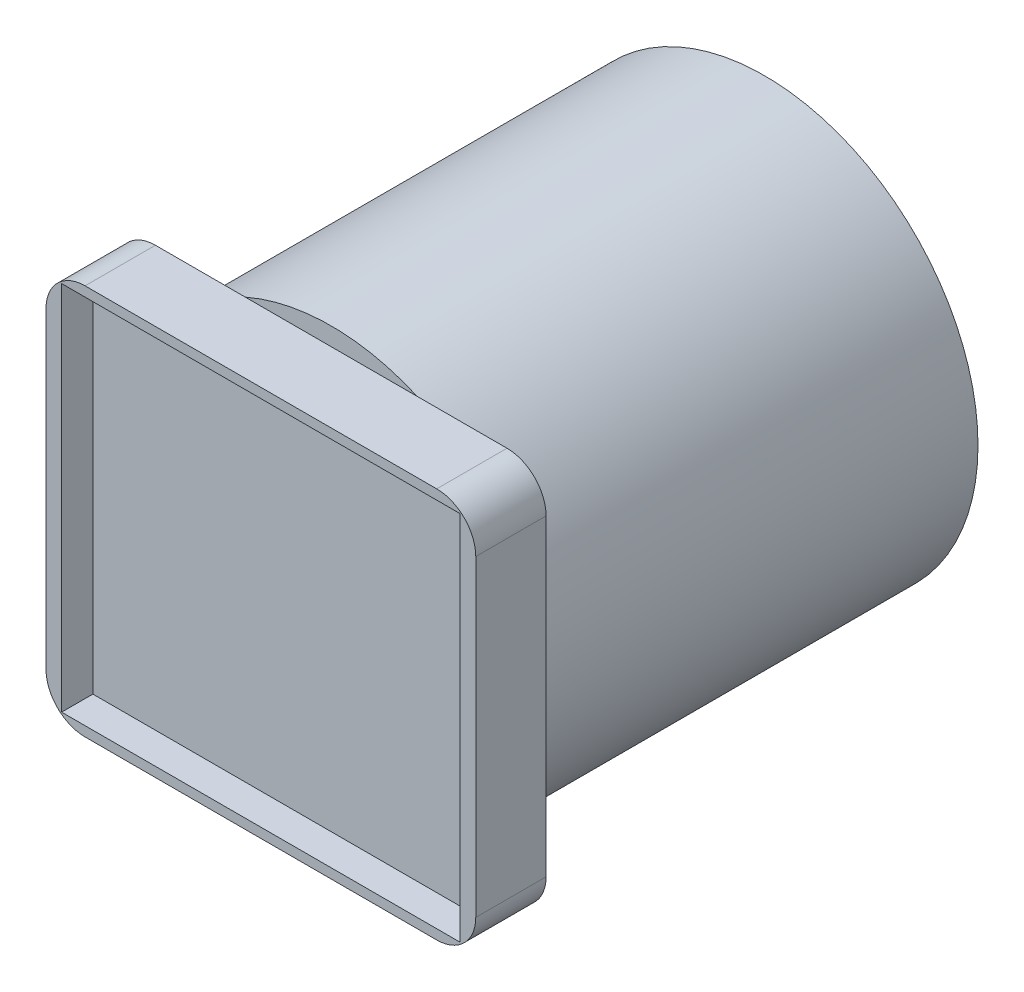
ISO-10303-21;
HEADER;
FILE_DESCRIPTION(('STEP AP214'),'2;1');
FILE_NAME('part.step','',(''),(''),'','','');
FILE_SCHEMA(('AUTOMOTIVE_DESIGN { 1 0 10303 214 1 1 1 1 }'));
ENDSEC;
DATA;
#1=APPLICATION_CONTEXT('core data for automotive mechanical design processes');
#2=APPLICATION_PROTOCOL_DEFINITION('international standard','automotive_design',2000,#1);
#3=PRODUCT_CONTEXT('',#1,'mechanical');
#4=PRODUCT('Part','Part','',(#3));
#5=PRODUCT_RELATED_PRODUCT_CATEGORY('part','',(#4));
#6=PRODUCT_DEFINITION_FORMATION('','',#4);
#7=PRODUCT_DEFINITION_CONTEXT('part definition',#1,'design');
#8=PRODUCT_DEFINITION('design','',#6,#7);
#9=PRODUCT_DEFINITION_SHAPE('','',#8);
#10=(LENGTH_UNIT() NAMED_UNIT(*) SI_UNIT(.MILLI.,.METRE.));
#11=(NAMED_UNIT(*) PLANE_ANGLE_UNIT() SI_UNIT($,.RADIAN.));
#12=(NAMED_UNIT(*) SI_UNIT($,.STERADIAN.) SOLID_ANGLE_UNIT());
#13=UNCERTAINTY_MEASURE_WITH_UNIT(LENGTH_MEASURE(1.E-05),#10,'distance_accuracy_value','');
#14=(GEOMETRIC_REPRESENTATION_CONTEXT(3) GLOBAL_UNCERTAINTY_ASSIGNED_CONTEXT((#13)) GLOBAL_UNIT_ASSIGNED_CONTEXT((#10,
#11,#12)) REPRESENTATION_CONTEXT('',''));
#15=CARTESIAN_POINT('',(0.,0.,0.));
#16=DIRECTION('',(0.,0.,1.));
#17=DIRECTION('',(1.,0.,0.));
#18=AXIS2_PLACEMENT_3D('',#15,#16,#17);
#19=CARTESIAN_POINT('',(0.,0.,-2.54));
#20=DIRECTION('',(0.,0.,-1.));
#21=DIRECTION('',(-1.,0.,0.));
#22=AXIS2_PLACEMENT_3D('',#19,#20,#21);
#23=PLANE('',#22);
#24=DIRECTION('',(0.,-1.,0.));
#25=VECTOR('',#24,1.);
#26=CARTESIAN_POINT('',(13.97,12.7,-2.54));
#27=LINE('',#26,#25);
#28=CARTESIAN_POINT('',(13.97,10.16,-2.54));
#29=VERTEX_POINT('',#28);
#30=CARTESIAN_POINT('',(13.97,-10.16,-2.54));
#31=VERTEX_POINT('',#30);
#32=EDGE_CURVE('E141',#29,#31,#27,.T.);
#33=ORIENTED_EDGE('',*,*,#32,.T.);
#34=CARTESIAN_POINT('',(11.43,-10.16,-2.54));
#35=DIRECTION('',(0.,0.,-1.));
#36=DIRECTION('',(-1.,0.,0.));
#37=AXIS2_PLACEMENT_3D('',#34,#35,#36);
#38=CIRCLE('',#37,2.54);
#39=CARTESIAN_POINT('',(11.43,-12.7,-2.54));
#40=VERTEX_POINT('',#39);
#41=EDGE_CURVE('E224',#31,#40,#38,.T.);
#42=ORIENTED_EDGE('',*,*,#41,.T.);
#43=DIRECTION('',(-1.,0.,0.));
#44=VECTOR('',#43,1.);
#45=CARTESIAN_POINT('',(13.97,-12.7,-2.54));
#46=LINE('',#45,#44);
#47=CARTESIAN_POINT('',(5.5873685722798,-12.7,-2.54));
#48=VERTEX_POINT('',#47);
#49=EDGE_CURVE('E169',#40,#48,#46,.T.);
#50=ORIENTED_EDGE('',*,*,#49,.T.);
#51=CARTESIAN_POINT('',(0.,0.,-2.54));
#52=DIRECTION('',(0.,0.,-1.));
#53=DIRECTION('',(-1.,0.,0.));
#54=AXIS2_PLACEMENT_3D('',#51,#52,#53);
#55=CIRCLE('',#54,13.87475);
#56=CARTESIAN_POINT('',(5.58736857227979,12.7,-2.54));
#57=VERTEX_POINT('',#56);
#58=EDGE_CURVE('E160',#57,#48,#55,.T.);
#59=ORIENTED_EDGE('',*,*,#58,.F.);
#60=DIRECTION('',(1.,0.,0.));
#61=VECTOR('',#60,1.);
#62=CARTESIAN_POINT('',(-13.97,12.7,-2.54));
#63=LINE('',#62,#61);
#64=CARTESIAN_POINT('',(11.43,12.7,-2.54));
#65=VERTEX_POINT('',#64);
#66=EDGE_CURVE('E144',#57,#65,#63,.T.);
#67=ORIENTED_EDGE('',*,*,#66,.T.);
#68=CARTESIAN_POINT('',(11.43,10.16,-2.54));
#69=DIRECTION('',(0.,0.,-1.));
#70=DIRECTION('',(-1.,0.,0.));
#71=AXIS2_PLACEMENT_3D('',#68,#69,#70);
#72=CIRCLE('',#71,2.54);
#73=EDGE_CURVE('E222',#65,#29,#72,.T.);
#74=ORIENTED_EDGE('',*,*,#73,.T.);
#75=EDGE_LOOP('',(#33,#42,#50,#59,#67,#74));
#76=FACE_BOUND('',#75,.T.);
#77=ADVANCED_FACE('F36',(#76),#23,.T.);
#78=CARTESIAN_POINT('',(0.,0.,2.032));
#79=DIRECTION('',(0.,0.,1.));
#80=DIRECTION('',(1.,0.,0.));
#81=AXIS2_PLACEMENT_3D('',#78,#79,#80);
#82=PLANE('',#81);
#83=DIRECTION('',(1.,0.,0.));
#84=VECTOR('',#83,1.);
#85=CARTESIAN_POINT('',(13.97,-12.7,2.032));
#86=LINE('',#85,#84);
#87=CARTESIAN_POINT('',(-11.43,-12.7,2.032));
#88=VERTEX_POINT('',#87);
#89=CARTESIAN_POINT('',(11.43,-12.7,2.032));
#90=VERTEX_POINT('',#89);
#91=EDGE_CURVE('E209',#88,#90,#86,.T.);
#92=ORIENTED_EDGE('',*,*,#91,.T.);
#93=CARTESIAN_POINT('',(11.43,-10.16,2.032));
#94=DIRECTION('',(0.,0.,1.));
#95=DIRECTION('',(1.,0.,0.));
#96=AXIS2_PLACEMENT_3D('',#93,#94,#95);
#97=CIRCLE('',#96,2.54);
#98=CARTESIAN_POINT('',(13.97,-10.16,2.032));
#99=VERTEX_POINT('',#98);
#100=EDGE_CURVE('E237',#90,#99,#97,.T.);
#101=ORIENTED_EDGE('',*,*,#100,.T.);
#102=DIRECTION('',(0.,1.,0.));
#103=VECTOR('',#102,1.);
#104=CARTESIAN_POINT('',(13.97,-12.7,2.032));
#105=LINE('',#104,#103);
#106=CARTESIAN_POINT('',(13.97,10.16,2.032));
#107=VERTEX_POINT('',#106);
#108=EDGE_CURVE('E212',#99,#107,#105,.T.);
#109=ORIENTED_EDGE('',*,*,#108,.T.);
#110=CARTESIAN_POINT('',(11.43,10.16,2.032));
#111=DIRECTION('',(0.,0.,1.));
#112=DIRECTION('',(1.,0.,0.));
#113=AXIS2_PLACEMENT_3D('',#110,#111,#112);
#114=CIRCLE('',#113,2.54);
#115=CARTESIAN_POINT('',(11.43,12.7,2.032));
#116=VERTEX_POINT('',#115);
#117=EDGE_CURVE('E231',#107,#116,#114,.T.);
#118=ORIENTED_EDGE('',*,*,#117,.T.);
#119=DIRECTION('',(-1.,0.,0.));
#120=VECTOR('',#119,1.);
#121=CARTESIAN_POINT('',(13.97,12.7,2.032));
#122=LINE('',#121,#120);
#123=CARTESIAN_POINT('',(-11.43,12.7,2.032));
#124=VERTEX_POINT('',#123);
#125=EDGE_CURVE('E161',#116,#124,#122,.T.);
#126=ORIENTED_EDGE('',*,*,#125,.T.);
#127=CARTESIAN_POINT('',(-11.43,10.16,2.032));
#128=DIRECTION('',(0.,0.,1.));
#129=DIRECTION('',(1.,0.,0.));
#130=AXIS2_PLACEMENT_3D('',#127,#128,#129);
#131=CIRCLE('',#130,2.54);
#132=CARTESIAN_POINT('',(-13.97,10.16,2.032));
#133=VERTEX_POINT('',#132);
#134=EDGE_CURVE('E233',#124,#133,#131,.T.);
#135=ORIENTED_EDGE('',*,*,#134,.T.);
#136=DIRECTION('',(0.,-1.,0.));
#137=VECTOR('',#136,1.);
#138=CARTESIAN_POINT('',(-13.97,-12.7,2.032));
#139=LINE('',#138,#137);
#140=CARTESIAN_POINT('',(-13.97,-10.16,2.032));
#141=VERTEX_POINT('',#140);
#142=EDGE_CURVE('E206',#133,#141,#139,.T.);
#143=ORIENTED_EDGE('',*,*,#142,.T.);
#144=CARTESIAN_POINT('',(-11.43,-10.16,2.032));
#145=DIRECTION('',(0.,0.,1.));
#146=DIRECTION('',(1.,0.,0.));
#147=AXIS2_PLACEMENT_3D('',#144,#145,#146);
#148=CIRCLE('',#147,2.54);
#149=EDGE_CURVE('E235',#141,#88,#148,.T.);
#150=ORIENTED_EDGE('',*,*,#149,.T.);
#151=EDGE_LOOP('',(#92,#101,#109,#118,#126,#135,#143,#150));
#152=FACE_BOUND('',#151,.T.);
#153=DIRECTION('',(1.,0.,0.));
#154=VECTOR('',#153,1.);
#155=CARTESIAN_POINT('',(12.954,-12.065,2.032));
#156=LINE('',#155,#154);
#157=CARTESIAN_POINT('',(-12.954,-12.065,2.032));
#158=VERTEX_POINT('',#157);
#159=CARTESIAN_POINT('',(12.954,-12.065,2.032));
#160=VERTEX_POINT('',#159);
#161=EDGE_CURVE('E179',#158,#160,#156,.T.);
#162=ORIENTED_EDGE('',*,*,#161,.F.);
#163=DIRECTION('',(0.,-1.,0.));
#164=VECTOR('',#163,1.);
#165=CARTESIAN_POINT('',(-12.954,-12.065,2.032));
#166=LINE('',#165,#164);
#167=CARTESIAN_POINT('',(-12.954,12.065,2.032));
#168=VERTEX_POINT('',#167);
#169=EDGE_CURVE('E177',#168,#158,#166,.T.);
#170=ORIENTED_EDGE('',*,*,#169,.F.);
#171=DIRECTION('',(-1.,0.,0.));
#172=VECTOR('',#171,1.);
#173=CARTESIAN_POINT('',(12.954,12.065,2.032));
#174=LINE('',#173,#172);
#175=CARTESIAN_POINT('',(12.954,12.065,2.032));
#176=VERTEX_POINT('',#175);
#177=EDGE_CURVE('E185',#176,#168,#174,.T.);
#178=ORIENTED_EDGE('',*,*,#177,.F.);
#179=DIRECTION('',(0.,1.,0.));
#180=VECTOR('',#179,1.);
#181=CARTESIAN_POINT('',(12.954,-12.065,2.032));
#182=LINE('',#181,#180);
#183=EDGE_CURVE('E182',#160,#176,#182,.T.);
#184=ORIENTED_EDGE('',*,*,#183,.F.);
#185=EDGE_LOOP('',(#162,#170,#178,#184));
#186=FACE_BOUND('',#185,.T.);
#187=ADVANCED_FACE('F270',(#152,#186),#82,.T.);
#188=CARTESIAN_POINT('',(-13.97,-12.7,2.032));
#189=DIRECTION('',(1.,0.,0.));
#190=DIRECTION('',(0.,0.,-1.));
#191=AXIS2_PLACEMENT_3D('',#188,#189,#190);
#192=PLANE('',#191);
#193=DIRECTION('',(0.,1.,0.));
#194=VECTOR('',#193,1.);
#195=CARTESIAN_POINT('',(-13.97,-12.7,-2.54));
#196=LINE('',#195,#194);
#197=CARTESIAN_POINT('',(-13.97,-10.16,-2.54));
#198=VERTEX_POINT('',#197);
#199=CARTESIAN_POINT('',(-13.97,10.16,-2.54));
#200=VERTEX_POINT('',#199);
#201=EDGE_CURVE('E171',#198,#200,#196,.T.);
#202=ORIENTED_EDGE('',*,*,#201,.F.);
#203=DIRECTION('',(0.,0.,-1.));
#204=VECTOR('',#203,1.);
#205=CARTESIAN_POINT('',(-13.97,-10.16,2.032));
#206=LINE('',#205,#204);
#207=EDGE_CURVE('E244',#198,#141,#206,.F.);
#208=ORIENTED_EDGE('',*,*,#207,.T.);
#209=ORIENTED_EDGE('',*,*,#142,.F.);
#210=DIRECTION('',(0.,0.,-1.));
#211=VECTOR('',#210,1.);
#212=CARTESIAN_POINT('',(-13.97,10.16,2.032));
#213=LINE('',#212,#211);
#214=EDGE_CURVE('E242',#133,#200,#213,.T.);
#215=ORIENTED_EDGE('',*,*,#214,.T.);
#216=EDGE_LOOP('',(#202,#208,#209,#215));
#217=FACE_BOUND('',#216,.T.);
#218=ADVANCED_FACE('F274',(#217),#192,.F.);
#219=CARTESIAN_POINT('',(13.97,-12.7,2.032));
#220=DIRECTION('',(0.,1.,0.));
#221=DIRECTION('',(-1.,0.,0.));
#222=AXIS2_PLACEMENT_3D('',#219,#220,#221);
#223=PLANE('',#222);
#224=ORIENTED_EDGE('',*,*,#49,.F.);
#225=DIRECTION('',(0.,0.,-1.));
#226=VECTOR('',#225,1.);
#227=CARTESIAN_POINT('',(11.43,-12.7,2.032));
#228=LINE('',#227,#226);
#229=EDGE_CURVE('E229',#40,#90,#228,.F.);
#230=ORIENTED_EDGE('',*,*,#229,.T.);
#231=ORIENTED_EDGE('',*,*,#91,.F.);
#232=DIRECTION('',(0.,0.,-1.));
#233=VECTOR('',#232,1.);
#234=CARTESIAN_POINT('',(-11.43,-12.7,2.032));
#235=LINE('',#234,#233);
#236=CARTESIAN_POINT('',(-11.43,-12.7,-2.54));
#237=VERTEX_POINT('',#236);
#238=EDGE_CURVE('E226',#88,#237,#235,.T.);
#239=ORIENTED_EDGE('',*,*,#238,.T.);
#240=CARTESIAN_POINT('',(-5.58736857227979,-12.7,-2.54));
#241=VERTEX_POINT('',#240);
#242=EDGE_CURVE('E166',#241,#237,#46,.T.);
#243=ORIENTED_EDGE('',*,*,#242,.F.);
#244=EDGE_CURVE('E172',#48,#241,#46,.T.);
#245=ORIENTED_EDGE('',*,*,#244,.F.);
#246=EDGE_LOOP('',(#224,#230,#231,#239,#243,#245));
#247=FACE_BOUND('',#246,.T.);
#248=ADVANCED_FACE('F256',(#247),#223,.F.);
#249=CARTESIAN_POINT('',(13.97,-12.7,2.032));
#250=DIRECTION('',(-1.,0.,0.));
#251=DIRECTION('',(0.,0.,1.));
#252=AXIS2_PLACEMENT_3D('',#249,#250,#251);
#253=PLANE('',#252);
#254=ORIENTED_EDGE('',*,*,#108,.F.);
#255=DIRECTION('',(0.,0.,-1.));
#256=VECTOR('',#255,1.);
#257=CARTESIAN_POINT('',(13.97,-10.16,2.032));
#258=LINE('',#257,#256);
#259=EDGE_CURVE('E219',#99,#31,#258,.T.);
#260=ORIENTED_EDGE('',*,*,#259,.T.);
#261=ORIENTED_EDGE('',*,*,#32,.F.);
#262=DIRECTION('',(0.,0.,-1.));
#263=VECTOR('',#262,1.);
#264=CARTESIAN_POINT('',(13.97,10.16,2.032));
#265=LINE('',#264,#263);
#266=EDGE_CURVE('E217',#29,#107,#265,.F.);
#267=ORIENTED_EDGE('',*,*,#266,.T.);
#268=EDGE_LOOP('',(#254,#260,#261,#267));
#269=FACE_BOUND('',#268,.T.);
#270=ADVANCED_FACE('F299',(#269),#253,.F.);
#271=CARTESIAN_POINT('',(13.97,12.7,2.032));
#272=DIRECTION('',(0.,-1.,0.));
#273=DIRECTION('',(1.,0.,0.));
#274=AXIS2_PLACEMENT_3D('',#271,#272,#273);
#275=PLANE('',#274);
#276=CARTESIAN_POINT('',(-11.43,12.7,-2.54));
#277=VERTEX_POINT('',#276);
#278=CARTESIAN_POINT('',(-5.5873685722798,12.7,-2.54));
#279=VERTEX_POINT('',#278);
#280=EDGE_CURVE('E133',#277,#279,#63,.T.);
#281=ORIENTED_EDGE('',*,*,#280,.F.);
#282=DIRECTION('',(0.,0.,-1.));
#283=VECTOR('',#282,1.);
#284=CARTESIAN_POINT('',(-11.43,12.7,2.032));
#285=LINE('',#284,#283);
#286=EDGE_CURVE('E11',#277,#124,#285,.F.);
#287=ORIENTED_EDGE('',*,*,#286,.T.);
#288=ORIENTED_EDGE('',*,*,#125,.F.);
#289=DIRECTION('',(0.,0.,-1.));
#290=VECTOR('',#289,1.);
#291=CARTESIAN_POINT('',(11.43,12.7,2.032));
#292=LINE('',#291,#290);
#293=EDGE_CURVE('E44',#116,#65,#292,.T.);
#294=ORIENTED_EDGE('',*,*,#293,.T.);
#295=ORIENTED_EDGE('',*,*,#66,.F.);
#296=EDGE_CURVE('E142',#279,#57,#63,.T.);
#297=ORIENTED_EDGE('',*,*,#296,.F.);
#298=EDGE_LOOP('',(#281,#287,#288,#294,#295,#297));
#299=FACE_BOUND('',#298,.T.);
#300=ADVANCED_FACE('F147',(#299),#275,.F.);
#301=CARTESIAN_POINT('',(-12.954,-12.065,2.032));
#302=DIRECTION('',(1.,0.,0.));
#303=DIRECTION('',(0.,0.,-1.));
#304=AXIS2_PLACEMENT_3D('',#301,#302,#303);
#305=PLANE('',#304);
#306=DIRECTION('',(0.,-1.,0.));
#307=VECTOR('',#306,1.);
#308=CARTESIAN_POINT('',(-12.954,-12.065,0.));
#309=LINE('',#308,#307);
#310=CARTESIAN_POINT('',(-12.954,12.065,0.));
#311=VERTEX_POINT('',#310);
#312=CARTESIAN_POINT('',(-12.954,-12.065,0.));
#313=VERTEX_POINT('',#312);
#314=EDGE_CURVE('E176',#311,#313,#309,.T.);
#315=ORIENTED_EDGE('',*,*,#314,.F.);
#316=DIRECTION('',(0.,0.,-1.));
#317=VECTOR('',#316,1.);
#318=CARTESIAN_POINT('',(-12.954,12.065,2.032));
#319=LINE('',#318,#317);
#320=EDGE_CURVE('E187',#168,#311,#319,.T.);
#321=ORIENTED_EDGE('',*,*,#320,.F.);
#322=ORIENTED_EDGE('',*,*,#169,.T.);
#323=DIRECTION('',(0.,0.,-1.));
#324=VECTOR('',#323,1.);
#325=CARTESIAN_POINT('',(-12.954,-12.065,2.032));
#326=LINE('',#325,#324);
#327=EDGE_CURVE('E203',#158,#313,#326,.T.);
#328=ORIENTED_EDGE('',*,*,#327,.T.);
#329=EDGE_LOOP('',(#315,#321,#322,#328));
#330=FACE_BOUND('',#329,.T.);
#331=ADVANCED_FACE('F292',(#330),#305,.T.);
#332=CARTESIAN_POINT('',(12.954,-12.065,2.032));
#333=DIRECTION('',(0.,1.,0.));
#334=DIRECTION('',(-1.,0.,0.));
#335=AXIS2_PLACEMENT_3D('',#332,#333,#334);
#336=PLANE('',#335);
#337=DIRECTION('',(1.,0.,0.));
#338=VECTOR('',#337,1.);
#339=CARTESIAN_POINT('',(12.954,-12.065,0.));
#340=LINE('',#339,#338);
#341=CARTESIAN_POINT('',(12.954,-12.065,0.));
#342=VERTEX_POINT('',#341);
#343=EDGE_CURVE('E190',#313,#342,#340,.T.);
#344=ORIENTED_EDGE('',*,*,#343,.F.);
#345=ORIENTED_EDGE('',*,*,#327,.F.);
#346=ORIENTED_EDGE('',*,*,#161,.T.);
#347=DIRECTION('',(0.,0.,-1.));
#348=VECTOR('',#347,1.);
#349=CARTESIAN_POINT('',(12.954,-12.065,2.032));
#350=LINE('',#349,#348);
#351=EDGE_CURVE('E201',#160,#342,#350,.T.);
#352=ORIENTED_EDGE('',*,*,#351,.T.);
#353=EDGE_LOOP('',(#344,#345,#346,#352));
#354=FACE_BOUND('',#353,.T.);
#355=ADVANCED_FACE('F288',(#354),#336,.T.);
#356=CARTESIAN_POINT('',(12.954,-12.065,2.032));
#357=DIRECTION('',(-1.,0.,0.));
#358=DIRECTION('',(0.,0.,1.));
#359=AXIS2_PLACEMENT_3D('',#356,#357,#358);
#360=PLANE('',#359);
#361=DIRECTION('',(0.,1.,0.));
#362=VECTOR('',#361,1.);
#363=CARTESIAN_POINT('',(12.954,-12.065,0.));
#364=LINE('',#363,#362);
#365=CARTESIAN_POINT('',(12.954,12.065,0.));
#366=VERTEX_POINT('',#365);
#367=EDGE_CURVE('E193',#342,#366,#364,.T.);
#368=ORIENTED_EDGE('',*,*,#367,.F.);
#369=ORIENTED_EDGE('',*,*,#351,.F.);
#370=ORIENTED_EDGE('',*,*,#183,.T.);
#371=DIRECTION('',(0.,0.,-1.));
#372=VECTOR('',#371,1.);
#373=CARTESIAN_POINT('',(12.954,12.065,2.032));
#374=LINE('',#373,#372);
#375=EDGE_CURVE('E199',#176,#366,#374,.T.);
#376=ORIENTED_EDGE('',*,*,#375,.T.);
#377=EDGE_LOOP('',(#368,#369,#370,#376));
#378=FACE_BOUND('',#377,.T.);
#379=ADVANCED_FACE('F284',(#378),#360,.T.);
#380=CARTESIAN_POINT('',(12.954,12.065,2.032));
#381=DIRECTION('',(0.,-1.,0.));
#382=DIRECTION('',(1.,0.,0.));
#383=AXIS2_PLACEMENT_3D('',#380,#381,#382);
#384=PLANE('',#383);
#385=DIRECTION('',(-1.,0.,0.));
#386=VECTOR('',#385,1.);
#387=CARTESIAN_POINT('',(12.954,12.065,0.));
#388=LINE('',#387,#386);
#389=EDGE_CURVE('E180',#366,#311,#388,.T.);
#390=ORIENTED_EDGE('',*,*,#389,.F.);
#391=ORIENTED_EDGE('',*,*,#375,.F.);
#392=ORIENTED_EDGE('',*,*,#177,.T.);
#393=ORIENTED_EDGE('',*,*,#320,.T.);
#394=EDGE_LOOP('',(#390,#391,#392,#393));
#395=FACE_BOUND('',#394,.T.);
#396=ADVANCED_FACE('F280',(#395),#384,.T.);
#397=CARTESIAN_POINT('',(0.,0.,0.));
#398=DIRECTION('',(0.,0.,-1.));
#399=DIRECTION('',(-1.,0.,0.));
#400=AXIS2_PLACEMENT_3D('',#397,#398,#399);
#401=PLANE('',#400);
#402=ORIENTED_EDGE('',*,*,#389,.T.);
#403=ORIENTED_EDGE('',*,*,#314,.T.);
#404=ORIENTED_EDGE('',*,*,#343,.T.);
#405=ORIENTED_EDGE('',*,*,#367,.T.);
#406=EDGE_LOOP('',(#402,#403,#404,#405));
#407=FACE_BOUND('',#406,.T.);
#408=ADVANCED_FACE('F265',(#407),#401,.F.);
#409=ORIENTED_EDGE('',*,*,#242,.T.);
#410=CARTESIAN_POINT('',(-11.43,-10.16,-2.54));
#411=DIRECTION('',(0.,0.,-1.));
#412=DIRECTION('',(-1.,0.,0.));
#413=AXIS2_PLACEMENT_3D('',#410,#411,#412);
#414=CIRCLE('',#413,2.54);
#415=EDGE_CURVE('E240',#237,#198,#414,.T.);
#416=ORIENTED_EDGE('',*,*,#415,.T.);
#417=ORIENTED_EDGE('',*,*,#201,.T.);
#418=CARTESIAN_POINT('',(-11.43,10.16,-2.54));
#419=DIRECTION('',(0.,0.,-1.));
#420=DIRECTION('',(-1.,0.,0.));
#421=AXIS2_PLACEMENT_3D('',#418,#419,#420);
#422=CIRCLE('',#421,2.54);
#423=EDGE_CURVE('E51',#200,#277,#422,.T.);
#424=ORIENTED_EDGE('',*,*,#423,.T.);
#425=ORIENTED_EDGE('',*,*,#280,.T.);
#426=EDGE_CURVE('E138',#241,#279,#55,.T.);
#427=ORIENTED_EDGE('',*,*,#426,.F.);
#428=EDGE_LOOP('',(#409,#416,#417,#424,#425,#427));
#429=FACE_BOUND('',#428,.T.);
#430=ADVANCED_FACE('F136',(#429),#23,.T.);
#431=CARTESIAN_POINT('',(0.,0.,-2.54));
#432=DIRECTION('',(0.,0.,-1.));
#433=DIRECTION('',(-1.,0.,0.));
#434=AXIS2_PLACEMENT_3D('',#431,#432,#433);
#435=PLANE('',#434);
#436=EDGE_CURVE('E159',#48,#241,#55,.T.);
#437=ORIENTED_EDGE('',*,*,#436,.F.);
#438=ORIENTED_EDGE('',*,*,#244,.T.);
#439=EDGE_LOOP('',(#437,#438));
#440=FACE_BOUND('',#439,.T.);
#441=ADVANCED_FACE('F258',(#440),#435,.F.);
#442=EDGE_CURVE('E157',#279,#57,#55,.T.);
#443=ORIENTED_EDGE('',*,*,#442,.F.);
#444=ORIENTED_EDGE('',*,*,#296,.T.);
#445=EDGE_LOOP('',(#443,#444));
#446=FACE_BOUND('',#445,.T.);
#447=ADVANCED_FACE('F163',(#446),#435,.F.);
#448=CARTESIAN_POINT('',(0.,0.,-30.715));
#449=DIRECTION('',(0.,0.,1.));
#450=DIRECTION('',(1.,0.,0.));
#451=AXIS2_PLACEMENT_3D('',#448,#449,#450);
#452=CYLINDRICAL_SURFACE('',#451,13.87475);
#453=CARTESIAN_POINT('',(0.,0.,-30.715));
#454=DIRECTION('',(0.,0.,-1.));
#455=DIRECTION('',(-1.,0.,0.));
#456=AXIS2_PLACEMENT_3D('',#453,#454,#455);
#457=CIRCLE('',#456,13.87475);
#458=CARTESIAN_POINT('',(-13.87475,0.,-30.715));
#459=VERTEX_POINT('',#458);
#460=EDGE_CURVE('E164',#459,#459,#457,.T.);
#461=ORIENTED_EDGE('',*,*,#460,.F.);
#462=EDGE_LOOP('',(#461));
#463=FACE_BOUND('',#462,.T.);
#464=ORIENTED_EDGE('',*,*,#442,.T.);
#465=ORIENTED_EDGE('',*,*,#58,.T.);
#466=ORIENTED_EDGE('',*,*,#436,.T.);
#467=ORIENTED_EDGE('',*,*,#426,.T.);
#468=EDGE_LOOP('',(#464,#465,#466,#467));
#469=FACE_BOUND('',#468,.T.);
#470=ADVANCED_FACE('F155',(#463,#469),#452,.T.);
#471=CARTESIAN_POINT('',(0.,0.,-30.715));
#472=DIRECTION('',(0.,0.,-1.));
#473=DIRECTION('',(-1.,0.,0.));
#474=AXIS2_PLACEMENT_3D('',#471,#472,#473);
#475=PLANE('',#474);
#476=ORIENTED_EDGE('',*,*,#460,.T.);
#477=EDGE_LOOP('',(#476));
#478=FACE_BOUND('',#477,.T.);
#479=ADVANCED_FACE('F312',(#478),#475,.T.);
#480=CARTESIAN_POINT('',(11.43,-10.16,2.032));
#481=DIRECTION('',(0.,0.,-1.));
#482=DIRECTION('',(-1.,0.,0.));
#483=AXIS2_PLACEMENT_3D('',#480,#481,#482);
#484=CYLINDRICAL_SURFACE('',#483,2.54);
#485=ORIENTED_EDGE('',*,*,#100,.F.);
#486=ORIENTED_EDGE('',*,*,#229,.F.);
#487=ORIENTED_EDGE('',*,*,#41,.F.);
#488=ORIENTED_EDGE('',*,*,#259,.F.);
#489=EDGE_LOOP('',(#485,#486,#487,#488));
#490=FACE_BOUND('',#489,.T.);
#491=ADVANCED_FACE('F308',(#490),#484,.T.);
#492=CARTESIAN_POINT('',(-11.43,-10.16,2.032));
#493=DIRECTION('',(0.,0.,-1.));
#494=DIRECTION('',(-1.,0.,0.));
#495=AXIS2_PLACEMENT_3D('',#492,#493,#494);
#496=CYLINDRICAL_SURFACE('',#495,2.54);
#497=ORIENTED_EDGE('',*,*,#149,.F.);
#498=ORIENTED_EDGE('',*,*,#207,.F.);
#499=ORIENTED_EDGE('',*,*,#415,.F.);
#500=ORIENTED_EDGE('',*,*,#238,.F.);
#501=EDGE_LOOP('',(#497,#498,#499,#500));
#502=FACE_BOUND('',#501,.T.);
#503=ADVANCED_FACE('F311',(#502),#496,.T.);
#504=CARTESIAN_POINT('',(-11.43,10.16,2.032));
#505=DIRECTION('',(0.,0.,-1.));
#506=DIRECTION('',(-1.,0.,0.));
#507=AXIS2_PLACEMENT_3D('',#504,#505,#506);
#508=CYLINDRICAL_SURFACE('',#507,2.54);
#509=ORIENTED_EDGE('',*,*,#134,.F.);
#510=ORIENTED_EDGE('',*,*,#286,.F.);
#511=ORIENTED_EDGE('',*,*,#423,.F.);
#512=ORIENTED_EDGE('',*,*,#214,.F.);
#513=EDGE_LOOP('',(#509,#510,#511,#512));
#514=FACE_BOUND('',#513,.T.);
#515=ADVANCED_FACE('F315',(#514),#508,.T.);
#516=CARTESIAN_POINT('',(11.43,10.16,2.032));
#517=DIRECTION('',(0.,0.,-1.));
#518=DIRECTION('',(-1.,0.,0.));
#519=AXIS2_PLACEMENT_3D('',#516,#517,#518);
#520=CYLINDRICAL_SURFACE('',#519,2.54);
#521=ORIENTED_EDGE('',*,*,#117,.F.);
#522=ORIENTED_EDGE('',*,*,#266,.F.);
#523=ORIENTED_EDGE('',*,*,#73,.F.);
#524=ORIENTED_EDGE('',*,*,#293,.F.);
#525=EDGE_LOOP('',(#521,#522,#523,#524));
#526=FACE_BOUND('',#525,.T.);
#527=ADVANCED_FACE('F38',(#526),#520,.T.);
#528=CLOSED_SHELL('',(#77,#187,#218,#248,#270,#300,#331,#355,#379,#396,#408,#430,#441,#447,#470,
#479,#491,#503,#515,#527));
#529=MANIFOLD_SOLID_BREP('B2',#528);
#530=ADVANCED_BREP_SHAPE_REPRESENTATION('',(#18,#529),#14);
#531=SHAPE_DEFINITION_REPRESENTATION(#9,#530);
ENDSEC;
END-ISO-10303-21;
